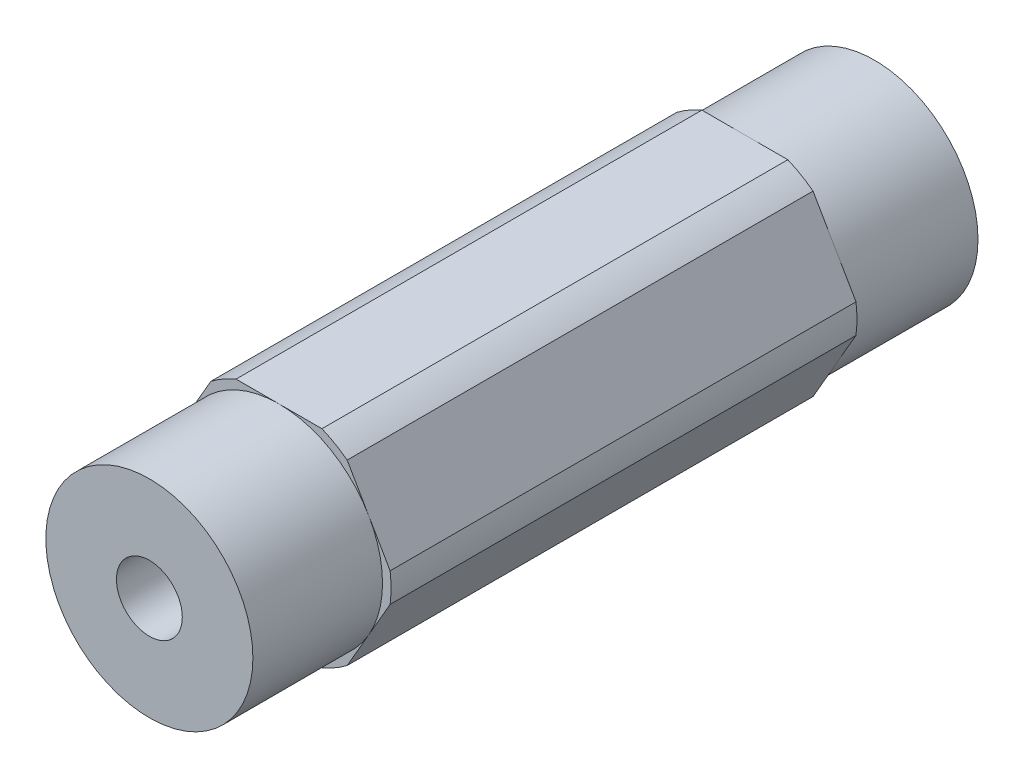
ISO-10303-21;
HEADER;
FILE_DESCRIPTION(('STEP AP214'),'2;1');
FILE_NAME('part.step','',(''),(''),'','','');
FILE_SCHEMA(('AUTOMOTIVE_DESIGN { 1 0 10303 214 1 1 1 1 }'));
ENDSEC;
DATA;
#1=APPLICATION_CONTEXT('core data for automotive mechanical design processes');
#2=APPLICATION_PROTOCOL_DEFINITION('international standard','automotive_design',2000,#1);
#3=PRODUCT_CONTEXT('',#1,'mechanical');
#4=PRODUCT('Part','Part','',(#3));
#5=PRODUCT_RELATED_PRODUCT_CATEGORY('part','',(#4));
#6=PRODUCT_DEFINITION_FORMATION('','',#4);
#7=PRODUCT_DEFINITION_CONTEXT('part definition',#1,'design');
#8=PRODUCT_DEFINITION('design','',#6,#7);
#9=PRODUCT_DEFINITION_SHAPE('','',#8);
#10=(LENGTH_UNIT() NAMED_UNIT(*) SI_UNIT(.MILLI.,.METRE.));
#11=(NAMED_UNIT(*) PLANE_ANGLE_UNIT() SI_UNIT($,.RADIAN.));
#12=(NAMED_UNIT(*) SI_UNIT($,.STERADIAN.) SOLID_ANGLE_UNIT());
#13=UNCERTAINTY_MEASURE_WITH_UNIT(LENGTH_MEASURE(1.E-05),#10,'distance_accuracy_value','');
#14=(GEOMETRIC_REPRESENTATION_CONTEXT(3) GLOBAL_UNCERTAINTY_ASSIGNED_CONTEXT((#13)) GLOBAL_UNIT_ASSIGNED_CONTEXT((#10,
#11,#12)) REPRESENTATION_CONTEXT('',''));
#15=CARTESIAN_POINT('',(0.,0.,0.));
#16=DIRECTION('',(0.,0.,1.));
#17=DIRECTION('',(1.,0.,0.));
#18=AXIS2_PLACEMENT_3D('',#15,#16,#17);
#19=CARTESIAN_POINT('',(3.66617420935409,6.34999999999998,22.2377));
#20=DIRECTION('',(0.,-1.,0.));
#21=DIRECTION('',(1.,0.,0.));
#22=AXIS2_PLACEMENT_3D('',#19,#20,#21);
#23=PLANE('',#22);
#24=DIRECTION('',(0.,0.,1.));
#25=VECTOR('',#24,1.);
#26=CARTESIAN_POINT('',(2.63498102459967,6.34999999999997,-22.2377));
#27=LINE('',#26,#25);
#28=CARTESIAN_POINT('',(2.63498102459967,6.34999999999997,-14.2875));
#29=VERTEX_POINT('',#28);
#30=CARTESIAN_POINT('',(2.63498102459967,6.34999999999997,14.2875));
#31=VERTEX_POINT('',#30);
#32=EDGE_CURVE('E325',#29,#31,#27,.T.);
#33=ORIENTED_EDGE('',*,*,#32,.F.);
#34=DIRECTION('',(1.,0.,0.));
#35=VECTOR('',#34,1.);
#36=CARTESIAN_POINT('',(3.66617420935409,6.34999999999998,-14.2875));
#37=LINE('',#36,#35);
#38=CARTESIAN_POINT('',(0.,6.34999999999997,-14.2875));
#39=VERTEX_POINT('',#38);
#40=EDGE_CURVE('E256',#39,#29,#37,.T.);
#41=ORIENTED_EDGE('',*,*,#40,.F.);
#42=CARTESIAN_POINT('',(-2.63498102459971,6.34999999999996,-14.2875));
#43=VERTEX_POINT('',#42);
#44=EDGE_CURVE('E260',#43,#39,#37,.T.);
#45=ORIENTED_EDGE('',*,*,#44,.F.);
#46=DIRECTION('',(0.,0.,1.));
#47=VECTOR('',#46,1.);
#48=CARTESIAN_POINT('',(-2.63498102459971,6.34999999999996,-22.2377));
#49=LINE('',#48,#47);
#50=CARTESIAN_POINT('',(-2.63498102459971,6.34999999999996,14.2875));
#51=VERTEX_POINT('',#50);
#52=EDGE_CURVE('E297',#51,#43,#49,.F.);
#53=ORIENTED_EDGE('',*,*,#52,.F.);
#54=DIRECTION('',(-1.,0.,0.));
#55=VECTOR('',#54,1.);
#56=CARTESIAN_POINT('',(3.66617420935409,6.34999999999998,14.2875));
#57=LINE('',#56,#55);
#58=CARTESIAN_POINT('',(0.,6.34999999999997,14.2875));
#59=VERTEX_POINT('',#58);
#60=EDGE_CURVE('E211',#59,#51,#57,.T.);
#61=ORIENTED_EDGE('',*,*,#60,.F.);
#62=EDGE_CURVE('E210',#31,#59,#57,.T.);
#63=ORIENTED_EDGE('',*,*,#62,.F.);
#64=EDGE_LOOP('',(#33,#41,#45,#53,#61,#63));
#65=FACE_BOUND('',#64,.T.);
#66=ADVANCED_FACE('F48',(#65),#23,.F.);
#67=CARTESIAN_POINT('',(-3.66617420935414,6.34999999999995,22.2377));
#68=DIRECTION('',(0.866025403784442,-0.499999999999995,0.));
#69=DIRECTION('',(0.499999999999995,0.866025403784442,0.));
#70=AXIS2_PLACEMENT_3D('',#67,#68,#69);
#71=PLANE('',#70);
#72=DIRECTION('',(0.,0.,1.));
#73=VECTOR('',#72,1.);
#74=CARTESIAN_POINT('',(-4.18177080173134,5.45696050579324,-22.2377));
#75=LINE('',#74,#73);
#76=CARTESIAN_POINT('',(-4.18177080173134,5.45696050579324,-14.2875));
#77=VERTEX_POINT('',#76);
#78=CARTESIAN_POINT('',(-4.18177080173134,5.45696050579324,14.2875));
#79=VERTEX_POINT('',#78);
#80=EDGE_CURVE('E300',#77,#79,#75,.T.);
#81=ORIENTED_EDGE('',*,*,#80,.F.);
#82=DIRECTION('',(0.499999999999995,0.866025403784442,0.));
#83=VECTOR('',#82,1.);
#84=CARTESIAN_POINT('',(-3.66617420935414,6.34999999999995,-14.2875));
#85=LINE('',#84,#83);
#86=CARTESIAN_POINT('',(-5.49926131403117,3.17499999999995,-14.2875));
#87=VERTEX_POINT('',#86);
#88=EDGE_CURVE('E247',#87,#77,#85,.T.);
#89=ORIENTED_EDGE('',*,*,#88,.F.);
#90=CARTESIAN_POINT('',(-6.81675182633101,0.893039494206661,-14.2875));
#91=VERTEX_POINT('',#90);
#92=EDGE_CURVE('E251',#91,#87,#85,.T.);
#93=ORIENTED_EDGE('',*,*,#92,.F.);
#94=DIRECTION('',(0.,0.,1.));
#95=VECTOR('',#94,1.);
#96=CARTESIAN_POINT('',(-6.81675182633101,0.893039494206661,-22.2377));
#97=LINE('',#96,#95);
#98=CARTESIAN_POINT('',(-6.81675182633101,0.893039494206661,14.2875));
#99=VERTEX_POINT('',#98);
#100=EDGE_CURVE('E71',#99,#91,#97,.F.);
#101=ORIENTED_EDGE('',*,*,#100,.F.);
#102=DIRECTION('',(-0.499999999999995,-0.866025403784442,0.));
#103=VECTOR('',#102,1.);
#104=CARTESIAN_POINT('',(-3.66617420935414,6.34999999999995,14.2875));
#105=LINE('',#104,#103);
#106=CARTESIAN_POINT('',(-5.49926131403117,3.17499999999995,14.2875));
#107=VERTEX_POINT('',#106);
#108=EDGE_CURVE('E216',#107,#99,#105,.T.);
#109=ORIENTED_EDGE('',*,*,#108,.F.);
#110=EDGE_CURVE('E215',#79,#107,#105,.T.);
#111=ORIENTED_EDGE('',*,*,#110,.F.);
#112=EDGE_LOOP('',(#81,#89,#93,#101,#109,#111));
#113=FACE_BOUND('',#112,.T.);
#114=ADVANCED_FACE('F436',(#113),#71,.F.);
#115=CARTESIAN_POINT('',(-7.33234841870821,0.,22.2377));
#116=DIRECTION('',(0.866025403784435,0.500000000000007,0.));
#117=DIRECTION('',(-0.500000000000007,0.866025403784435,0.));
#118=AXIS2_PLACEMENT_3D('',#115,#116,#117);
#119=PLANE('',#118);
#120=DIRECTION('',(0.,0.,1.));
#121=VECTOR('',#120,1.);
#122=CARTESIAN_POINT('',(-6.81675182633099,-0.893039494206758,-22.2377));
#123=LINE('',#122,#121);
#124=CARTESIAN_POINT('',(-6.81675182633099,-0.893039494206758,-14.2875));
#125=VERTEX_POINT('',#124);
#126=CARTESIAN_POINT('',(-6.81675182633099,-0.893039494206758,14.2875));
#127=VERTEX_POINT('',#126);
#128=EDGE_CURVE('E287',#125,#127,#123,.T.);
#129=ORIENTED_EDGE('',*,*,#128,.F.);
#130=DIRECTION('',(-0.500000000000007,0.866025403784435,0.));
#131=VECTOR('',#130,1.);
#132=CARTESIAN_POINT('',(-7.33234841870821,0.,-14.2875));
#133=LINE('',#132,#131);
#134=CARTESIAN_POINT('',(-5.49926131403113,-3.17500000000003,-14.2875));
#135=VERTEX_POINT('',#134);
#136=EDGE_CURVE('E241',#135,#125,#133,.T.);
#137=ORIENTED_EDGE('',*,*,#136,.F.);
#138=CARTESIAN_POINT('',(-4.18177080173127,-5.4569605057933,-14.2875));
#139=VERTEX_POINT('',#138);
#140=EDGE_CURVE('E245',#139,#135,#133,.T.);
#141=ORIENTED_EDGE('',*,*,#140,.F.);
#142=DIRECTION('',(0.,0.,1.));
#143=VECTOR('',#142,1.);
#144=CARTESIAN_POINT('',(-4.18177080173127,-5.4569605057933,-22.2377));
#145=LINE('',#144,#143);
#146=CARTESIAN_POINT('',(-4.18177080173127,-5.4569605057933,14.2875));
#147=VERTEX_POINT('',#146);
#148=EDGE_CURVE('E63',#147,#139,#145,.F.);
#149=ORIENTED_EDGE('',*,*,#148,.F.);
#150=DIRECTION('',(0.500000000000007,-0.866025403784435,0.));
#151=VECTOR('',#150,1.);
#152=CARTESIAN_POINT('',(-7.33234841870821,0.,14.2875));
#153=LINE('',#152,#151);
#154=CARTESIAN_POINT('',(-5.49926131403113,-3.17500000000003,14.2875));
#155=VERTEX_POINT('',#154);
#156=EDGE_CURVE('E221',#155,#147,#153,.T.);
#157=ORIENTED_EDGE('',*,*,#156,.F.);
#158=EDGE_CURVE('E220',#127,#155,#153,.T.);
#159=ORIENTED_EDGE('',*,*,#158,.F.);
#160=EDGE_LOOP('',(#129,#137,#141,#149,#157,#159));
#161=FACE_BOUND('',#160,.T.);
#162=ADVANCED_FACE('F429',(#161),#119,.F.);
#163=CARTESIAN_POINT('',(-3.66617420935405,-6.35,22.2377));
#164=DIRECTION('',(0.,1.,0.));
#165=DIRECTION('',(-1.,0.,0.));
#166=AXIS2_PLACEMENT_3D('',#163,#164,#165);
#167=PLANE('',#166);
#168=DIRECTION('',(0.,0.,1.));
#169=VECTOR('',#168,1.);
#170=CARTESIAN_POINT('',(-2.63498102459963,-6.34999999999999,-22.2377));
#171=LINE('',#170,#169);
#172=CARTESIAN_POINT('',(-2.63498102459963,-6.34999999999999,-14.2875));
#173=VERTEX_POINT('',#172);
#174=CARTESIAN_POINT('',(-2.63498102459963,-6.34999999999999,14.2875));
#175=VERTEX_POINT('',#174);
#176=EDGE_CURVE('E275',#173,#175,#171,.T.);
#177=ORIENTED_EDGE('',*,*,#176,.F.);
#178=DIRECTION('',(-1.,0.,0.));
#179=VECTOR('',#178,1.);
#180=CARTESIAN_POINT('',(-3.66617420935405,-6.35,-14.2875));
#181=LINE('',#180,#179);
#182=CARTESIAN_POINT('',(0.,-6.34999999999997,-14.2875));
#183=VERTEX_POINT('',#182);
#184=EDGE_CURVE('E246',#183,#173,#181,.T.);
#185=ORIENTED_EDGE('',*,*,#184,.F.);
#186=CARTESIAN_POINT('',(2.63498102459976,-6.34999999999994,-14.2875));
#187=VERTEX_POINT('',#186);
#188=EDGE_CURVE('E252',#187,#183,#181,.T.);
#189=ORIENTED_EDGE('',*,*,#188,.F.);
#190=DIRECTION('',(0.,0.,1.));
#191=VECTOR('',#190,1.);
#192=CARTESIAN_POINT('',(2.63498102459976,-6.34999999999994,-22.2377));
#193=LINE('',#192,#191);
#194=CARTESIAN_POINT('',(2.63498102459976,-6.34999999999994,14.2875));
#195=VERTEX_POINT('',#194);
#196=EDGE_CURVE('E311',#195,#187,#193,.F.);
#197=ORIENTED_EDGE('',*,*,#196,.F.);
#198=DIRECTION('',(1.,0.,0.));
#199=VECTOR('',#198,1.);
#200=CARTESIAN_POINT('',(-3.66617420935405,-6.35,14.2875));
#201=LINE('',#200,#199);
#202=CARTESIAN_POINT('',(0.,-6.34999999999997,14.2875));
#203=VERTEX_POINT('',#202);
#204=EDGE_CURVE('E226',#203,#195,#201,.T.);
#205=ORIENTED_EDGE('',*,*,#204,.F.);
#206=EDGE_CURVE('E225',#175,#203,#201,.T.);
#207=ORIENTED_EDGE('',*,*,#206,.F.);
#208=EDGE_LOOP('',(#177,#185,#189,#197,#205,#207));
#209=FACE_BOUND('',#208,.T.);
#210=ADVANCED_FACE('F443',(#209),#167,.F.);
#211=CARTESIAN_POINT('',(3.66617420935418,-6.34999999999993,22.2377));
#212=DIRECTION('',(-0.866025403784442,0.499999999999995,0.));
#213=DIRECTION('',(-0.499999999999995,-0.866025403784442,0.));
#214=AXIS2_PLACEMENT_3D('',#211,#212,#213);
#215=PLANE('',#214);
#216=DIRECTION('',(0.,0.,1.));
#217=VECTOR('',#216,1.);
#218=CARTESIAN_POINT('',(4.18177080173139,-5.4569605057932,-22.2377));
#219=LINE('',#218,#217);
#220=CARTESIAN_POINT('',(4.18177080173139,-5.4569605057932,-14.2875));
#221=VERTEX_POINT('',#220);
#222=CARTESIAN_POINT('',(4.18177080173139,-5.4569605057932,14.2875));
#223=VERTEX_POINT('',#222);
#224=EDGE_CURVE('E314',#221,#223,#219,.T.);
#225=ORIENTED_EDGE('',*,*,#224,.F.);
#226=DIRECTION('',(-0.499999999999995,-0.866025403784442,0.));
#227=VECTOR('',#226,1.);
#228=CARTESIAN_POINT('',(3.66617420935418,-6.34999999999993,-14.2875));
#229=LINE('',#228,#227);
#230=CARTESIAN_POINT('',(5.49926131403117,-3.17499999999995,-14.2875));
#231=VERTEX_POINT('',#230);
#232=EDGE_CURVE('E255',#231,#221,#229,.T.);
#233=ORIENTED_EDGE('',*,*,#232,.F.);
#234=CARTESIAN_POINT('',(6.816751826331,-0.893039494206728,-14.2875));
#235=VERTEX_POINT('',#234);
#236=EDGE_CURVE('E261',#235,#231,#229,.T.);
#237=ORIENTED_EDGE('',*,*,#236,.F.);
#238=DIRECTION('',(0.,0.,1.));
#239=VECTOR('',#238,1.);
#240=CARTESIAN_POINT('',(6.816751826331,-0.893039494206728,-22.2377));
#241=LINE('',#240,#239);
#242=CARTESIAN_POINT('',(6.816751826331,-0.893039494206728,14.2875));
#243=VERTEX_POINT('',#242);
#244=EDGE_CURVE('E176',#243,#235,#241,.F.);
#245=ORIENTED_EDGE('',*,*,#244,.F.);
#246=DIRECTION('',(0.499999999999995,0.866025403784442,0.));
#247=VECTOR('',#246,1.);
#248=CARTESIAN_POINT('',(3.66617420935418,-6.34999999999993,14.2875));
#249=LINE('',#248,#247);
#250=CARTESIAN_POINT('',(5.49926131403117,-3.17499999999995,14.2875));
#251=VERTEX_POINT('',#250);
#252=EDGE_CURVE('E231',#251,#243,#249,.T.);
#253=ORIENTED_EDGE('',*,*,#252,.F.);
#254=EDGE_CURVE('E230',#223,#251,#249,.T.);
#255=ORIENTED_EDGE('',*,*,#254,.F.);
#256=EDGE_LOOP('',(#225,#233,#237,#245,#253,#255));
#257=FACE_BOUND('',#256,.T.);
#258=ADVANCED_FACE('F477',(#257),#215,.F.);
#259=CARTESIAN_POINT('',(7.33234841870821,0.,22.2377));
#260=DIRECTION('',(-0.866025403784438,-0.500000000000001,0.));
#261=DIRECTION('',(0.500000000000001,-0.866025403784438,0.));
#262=AXIS2_PLACEMENT_3D('',#259,#260,#261);
#263=PLANE('',#262);
#264=DIRECTION('',(0.,0.,1.));
#265=VECTOR('',#264,1.);
#266=CARTESIAN_POINT('',(6.816751826331,0.89303949420671,-22.2377));
#267=LINE('',#266,#265);
#268=CARTESIAN_POINT('',(6.816751826331,0.893039494206714,-14.2875));
#269=VERTEX_POINT('',#268);
#270=CARTESIAN_POINT('',(6.816751826331,0.89303949420671,14.2875));
#271=VERTEX_POINT('',#270);
#272=EDGE_CURVE('E173',#269,#271,#267,.T.);
#273=ORIENTED_EDGE('',*,*,#272,.F.);
#274=DIRECTION('',(0.500000000000001,-0.866025403784438,0.));
#275=VECTOR('',#274,1.);
#276=CARTESIAN_POINT('',(7.33234841870821,0.,-14.2875));
#277=LINE('',#276,#275);
#278=CARTESIAN_POINT('',(5.49926131403115,3.17499999999999,-14.2875));
#279=VERTEX_POINT('',#278);
#280=EDGE_CURVE('E185',#279,#269,#277,.T.);
#281=ORIENTED_EDGE('',*,*,#280,.F.);
#282=CARTESIAN_POINT('',(4.18177080173131,5.45696050579327,-14.2875));
#283=VERTEX_POINT('',#282);
#284=EDGE_CURVE('E56',#283,#279,#277,.T.);
#285=ORIENTED_EDGE('',*,*,#284,.F.);
#286=DIRECTION('',(0.,0.,1.));
#287=VECTOR('',#286,1.);
#288=CARTESIAN_POINT('',(4.1817708017313,5.45696050579327,-22.2377));
#289=LINE('',#288,#287);
#290=CARTESIAN_POINT('',(4.1817708017313,5.45696050579327,14.2875));
#291=VERTEX_POINT('',#290);
#292=EDGE_CURVE('E328',#291,#283,#289,.F.);
#293=ORIENTED_EDGE('',*,*,#292,.F.);
#294=DIRECTION('',(-0.500000000000001,0.866025403784438,0.));
#295=VECTOR('',#294,1.);
#296=CARTESIAN_POINT('',(7.33234841870821,0.,14.2875));
#297=LINE('',#296,#295);
#298=CARTESIAN_POINT('',(5.49926131403115,3.17499999999999,14.2875));
#299=VERTEX_POINT('',#298);
#300=EDGE_CURVE('E202',#299,#291,#297,.T.);
#301=ORIENTED_EDGE('',*,*,#300,.F.);
#302=EDGE_CURVE('E187',#271,#299,#297,.T.);
#303=ORIENTED_EDGE('',*,*,#302,.F.);
#304=EDGE_LOOP('',(#273,#281,#285,#293,#301,#303));
#305=FACE_BOUND('',#304,.T.);
#306=ADVANCED_FACE('F183',(#305),#263,.F.);
#307=CARTESIAN_POINT('',(0.,0.,14.2875));
#308=DIRECTION('',(0.,0.,1.));
#309=DIRECTION('',(1.,0.,0.));
#310=AXIS2_PLACEMENT_3D('',#307,#308,#309);
#311=PLANE('',#310);
#312=ORIENTED_EDGE('',*,*,#300,.T.);
#313=CARTESIAN_POINT('',(0.,0.,14.2875));
#314=DIRECTION('',(0.,0.,1.));
#315=DIRECTION('',(1.,0.,0.));
#316=AXIS2_PLACEMENT_3D('',#313,#314,#315);
#317=CIRCLE('',#316,6.875);
#318=EDGE_CURVE('E321',#291,#31,#317,.T.);
#319=ORIENTED_EDGE('',*,*,#318,.T.);
#320=ORIENTED_EDGE('',*,*,#62,.T.);
#321=CARTESIAN_POINT('',(0.,0.,14.2875));
#322=DIRECTION('',(0.,0.,1.));
#323=DIRECTION('',(1.,0.,0.));
#324=AXIS2_PLACEMENT_3D('',#321,#322,#323);
#325=CIRCLE('',#324,6.34999999999997);
#326=EDGE_CURVE('E235',#299,#59,#325,.T.);
#327=ORIENTED_EDGE('',*,*,#326,.F.);
#328=EDGE_LOOP('',(#312,#319,#320,#327));
#329=FACE_BOUND('',#328,.T.);
#330=ADVANCED_FACE('F461',(#329),#311,.T.);
#331=ORIENTED_EDGE('',*,*,#60,.T.);
#332=CARTESIAN_POINT('',(0.,0.,14.2875));
#333=DIRECTION('',(0.,0.,1.));
#334=DIRECTION('',(1.,0.,0.));
#335=AXIS2_PLACEMENT_3D('',#332,#333,#334);
#336=CIRCLE('',#335,6.875);
#337=EDGE_CURVE('E293',#51,#79,#336,.T.);
#338=ORIENTED_EDGE('',*,*,#337,.T.);
#339=ORIENTED_EDGE('',*,*,#110,.T.);
#340=EDGE_CURVE('E239',#59,#107,#325,.T.);
#341=ORIENTED_EDGE('',*,*,#340,.F.);
#342=EDGE_LOOP('',(#331,#338,#339,#341));
#343=FACE_BOUND('',#342,.T.);
#344=ADVANCED_FACE('F385',(#343),#311,.T.);
#345=ORIENTED_EDGE('',*,*,#108,.T.);
#346=CARTESIAN_POINT('',(0.,0.,14.2875));
#347=DIRECTION('',(0.,0.,1.));
#348=DIRECTION('',(1.,0.,0.));
#349=AXIS2_PLACEMENT_3D('',#346,#347,#348);
#350=CIRCLE('',#349,6.875);
#351=EDGE_CURVE('E281',#99,#127,#350,.T.);
#352=ORIENTED_EDGE('',*,*,#351,.T.);
#353=ORIENTED_EDGE('',*,*,#158,.T.);
#354=EDGE_CURVE('E389',#107,#155,#325,.T.);
#355=ORIENTED_EDGE('',*,*,#354,.F.);
#356=EDGE_LOOP('',(#345,#352,#353,#355));
#357=FACE_BOUND('',#356,.T.);
#358=ADVANCED_FACE('F433',(#357),#311,.T.);
#359=ORIENTED_EDGE('',*,*,#156,.T.);
#360=CARTESIAN_POINT('',(0.,0.,14.2875));
#361=DIRECTION('',(0.,0.,1.));
#362=DIRECTION('',(1.,0.,0.));
#363=AXIS2_PLACEMENT_3D('',#360,#361,#362);
#364=CIRCLE('',#363,6.875);
#365=EDGE_CURVE('E269',#147,#175,#364,.T.);
#366=ORIENTED_EDGE('',*,*,#365,.T.);
#367=ORIENTED_EDGE('',*,*,#206,.T.);
#368=EDGE_CURVE('E391',#155,#203,#325,.T.);
#369=ORIENTED_EDGE('',*,*,#368,.F.);
#370=EDGE_LOOP('',(#359,#366,#367,#369));
#371=FACE_BOUND('',#370,.T.);
#372=ADVANCED_FACE('F447',(#371),#311,.T.);
#373=ORIENTED_EDGE('',*,*,#204,.T.);
#374=CARTESIAN_POINT('',(0.,0.,14.2875));
#375=DIRECTION('',(0.,0.,1.));
#376=DIRECTION('',(1.,0.,0.));
#377=AXIS2_PLACEMENT_3D('',#374,#375,#376);
#378=CIRCLE('',#377,6.875);
#379=EDGE_CURVE('E307',#195,#223,#378,.T.);
#380=ORIENTED_EDGE('',*,*,#379,.T.);
#381=ORIENTED_EDGE('',*,*,#254,.T.);
#382=EDGE_CURVE('E395',#203,#251,#325,.T.);
#383=ORIENTED_EDGE('',*,*,#382,.F.);
#384=EDGE_LOOP('',(#373,#380,#381,#383));
#385=FACE_BOUND('',#384,.T.);
#386=ADVANCED_FACE('F450',(#385),#311,.T.);
#387=ORIENTED_EDGE('',*,*,#252,.T.);
#388=CARTESIAN_POINT('',(0.,0.,14.2875));
#389=DIRECTION('',(0.,0.,1.));
#390=DIRECTION('',(1.,0.,0.));
#391=AXIS2_PLACEMENT_3D('',#388,#389,#390);
#392=CIRCLE('',#391,6.875);
#393=EDGE_CURVE('E335',#243,#271,#392,.T.);
#394=ORIENTED_EDGE('',*,*,#393,.T.);
#395=ORIENTED_EDGE('',*,*,#302,.T.);
#396=EDGE_CURVE('E240',#251,#299,#325,.T.);
#397=ORIENTED_EDGE('',*,*,#396,.F.);
#398=EDGE_LOOP('',(#387,#394,#395,#397));
#399=FACE_BOUND('',#398,.T.);
#400=ADVANCED_FACE('F456',(#399),#311,.T.);
#401=CARTESIAN_POINT('',(0.,0.,-14.2875));
#402=DIRECTION('',(0.,0.,-1.));
#403=DIRECTION('',(-1.,0.,0.));
#404=AXIS2_PLACEMENT_3D('',#401,#402,#403);
#405=PLANE('',#404);
#406=ORIENTED_EDGE('',*,*,#184,.T.);
#407=CARTESIAN_POINT('',(0.,0.,-14.2875));
#408=DIRECTION('',(0.,0.,-1.));
#409=DIRECTION('',(-1.,0.,0.));
#410=AXIS2_PLACEMENT_3D('',#407,#408,#409);
#411=CIRCLE('',#410,6.875);
#412=EDGE_CURVE('E278',#173,#139,#411,.T.);
#413=ORIENTED_EDGE('',*,*,#412,.T.);
#414=ORIENTED_EDGE('',*,*,#140,.T.);
#415=CARTESIAN_POINT('',(0.,0.,-14.2875));
#416=DIRECTION('',(0.,0.,1.));
#417=DIRECTION('',(1.,0.,0.));
#418=AXIS2_PLACEMENT_3D('',#415,#416,#417);
#419=CIRCLE('',#418,6.34999999999997);
#420=EDGE_CURVE('E409',#135,#183,#419,.T.);
#421=ORIENTED_EDGE('',*,*,#420,.T.);
#422=EDGE_LOOP('',(#406,#413,#414,#421));
#423=FACE_BOUND('',#422,.T.);
#424=ADVANCED_FACE('F408',(#423),#405,.T.);
#425=ORIENTED_EDGE('',*,*,#136,.T.);
#426=CARTESIAN_POINT('',(0.,0.,-14.2875));
#427=DIRECTION('',(0.,0.,-1.));
#428=DIRECTION('',(-1.,0.,0.));
#429=AXIS2_PLACEMENT_3D('',#426,#427,#428);
#430=CIRCLE('',#429,6.875);
#431=EDGE_CURVE('E290',#125,#91,#430,.T.);
#432=ORIENTED_EDGE('',*,*,#431,.T.);
#433=ORIENTED_EDGE('',*,*,#92,.T.);
#434=EDGE_CURVE('E419',#87,#135,#419,.T.);
#435=ORIENTED_EDGE('',*,*,#434,.T.);
#436=EDGE_LOOP('',(#425,#432,#433,#435));
#437=FACE_BOUND('',#436,.T.);
#438=ADVANCED_FACE('F425',(#437),#405,.T.);
#439=ORIENTED_EDGE('',*,*,#88,.T.);
#440=CARTESIAN_POINT('',(0.,0.,-14.2875));
#441=DIRECTION('',(0.,0.,-1.));
#442=DIRECTION('',(-1.,0.,0.));
#443=AXIS2_PLACEMENT_3D('',#440,#441,#442);
#444=CIRCLE('',#443,6.875);
#445=EDGE_CURVE('E303',#77,#43,#444,.T.);
#446=ORIENTED_EDGE('',*,*,#445,.T.);
#447=ORIENTED_EDGE('',*,*,#44,.T.);
#448=EDGE_CURVE('E268',#39,#87,#419,.T.);
#449=ORIENTED_EDGE('',*,*,#448,.T.);
#450=EDGE_LOOP('',(#439,#446,#447,#449));
#451=FACE_BOUND('',#450,.T.);
#452=ADVANCED_FACE('F480',(#451),#405,.T.);
#453=ORIENTED_EDGE('',*,*,#232,.T.);
#454=CARTESIAN_POINT('',(0.,0.,-14.2875));
#455=DIRECTION('',(0.,0.,-1.));
#456=DIRECTION('',(-1.,0.,0.));
#457=AXIS2_PLACEMENT_3D('',#454,#455,#456);
#458=CIRCLE('',#457,6.875);
#459=EDGE_CURVE('E317',#221,#187,#458,.T.);
#460=ORIENTED_EDGE('',*,*,#459,.T.);
#461=ORIENTED_EDGE('',*,*,#188,.T.);
#462=EDGE_CURVE('E422',#183,#231,#419,.T.);
#463=ORIENTED_EDGE('',*,*,#462,.T.);
#464=EDGE_LOOP('',(#453,#460,#461,#463));
#465=FACE_BOUND('',#464,.T.);
#466=ADVANCED_FACE('F476',(#465),#405,.T.);
#467=ORIENTED_EDGE('',*,*,#40,.T.);
#468=CARTESIAN_POINT('',(0.,0.,-14.2875));
#469=DIRECTION('',(0.,0.,-1.));
#470=DIRECTION('',(-1.,0.,0.));
#471=AXIS2_PLACEMENT_3D('',#468,#469,#470);
#472=CIRCLE('',#471,6.875);
#473=EDGE_CURVE('E331',#29,#283,#472,.T.);
#474=ORIENTED_EDGE('',*,*,#473,.T.);
#475=ORIENTED_EDGE('',*,*,#284,.T.);
#476=EDGE_CURVE('E264',#279,#39,#419,.T.);
#477=ORIENTED_EDGE('',*,*,#476,.T.);
#478=EDGE_LOOP('',(#467,#474,#475,#477));
#479=FACE_BOUND('',#478,.T.);
#480=ADVANCED_FACE('F467',(#479),#405,.T.);
#481=ORIENTED_EDGE('',*,*,#280,.T.);
#482=CARTESIAN_POINT('',(0.,0.,-14.2875));
#483=DIRECTION('',(0.,0.,-1.));
#484=DIRECTION('',(-1.,0.,0.));
#485=AXIS2_PLACEMENT_3D('',#482,#483,#484);
#486=CIRCLE('',#485,6.875);
#487=EDGE_CURVE('E12',#269,#235,#486,.T.);
#488=ORIENTED_EDGE('',*,*,#487,.T.);
#489=ORIENTED_EDGE('',*,*,#236,.T.);
#490=EDGE_CURVE('E194',#231,#279,#419,.T.);
#491=ORIENTED_EDGE('',*,*,#490,.T.);
#492=EDGE_LOOP('',(#481,#488,#489,#491));
#493=FACE_BOUND('',#492,.T.);
#494=ADVANCED_FACE('F192',(#493),#405,.T.);
#495=CARTESIAN_POINT('',(0.,0.,14.2875));
#496=DIRECTION('',(0.,0.,1.));
#497=DIRECTION('',(1.,0.,0.));
#498=AXIS2_PLACEMENT_3D('',#495,#496,#497);
#499=CYLINDRICAL_SURFACE('',#498,6.34999999999997);
#500=CARTESIAN_POINT('',(0.,0.,22.2377));
#501=DIRECTION('',(0.,0.,1.));
#502=DIRECTION('',(1.,0.,0.));
#503=AXIS2_PLACEMENT_3D('',#500,#501,#502);
#504=CIRCLE('',#503,6.34999999999997);
#505=CARTESIAN_POINT('',(6.34999999999997,0.,22.2377));
#506=VERTEX_POINT('',#505);
#507=EDGE_CURVE('E206',#506,#506,#504,.T.);
#508=ORIENTED_EDGE('',*,*,#507,.F.);
#509=EDGE_LOOP('',(#508));
#510=FACE_BOUND('',#509,.T.);
#511=ORIENTED_EDGE('',*,*,#326,.T.);
#512=ORIENTED_EDGE('',*,*,#340,.T.);
#513=ORIENTED_EDGE('',*,*,#354,.T.);
#514=ORIENTED_EDGE('',*,*,#368,.T.);
#515=ORIENTED_EDGE('',*,*,#382,.T.);
#516=ORIENTED_EDGE('',*,*,#396,.T.);
#517=EDGE_LOOP('',(#511,#512,#513,#514,#515,#516));
#518=FACE_BOUND('',#517,.T.);
#519=ADVANCED_FACE('F362',(#510,#518),#499,.T.);
#520=CARTESIAN_POINT('',(0.,0.,22.2377));
#521=DIRECTION('',(0.,0.,1.));
#522=DIRECTION('',(1.,0.,0.));
#523=AXIS2_PLACEMENT_3D('',#520,#521,#522);
#524=PLANE('',#523);
#525=CARTESIAN_POINT('',(0.,0.,22.2377));
#526=DIRECTION('',(0.,0.,1.));
#527=DIRECTION('',(1.,0.,0.));
#528=AXIS2_PLACEMENT_3D('',#525,#526,#527);
#529=CIRCLE('',#528,2.0193);
#530=CARTESIAN_POINT('',(2.0193,0.,22.2377));
#531=VERTEX_POINT('',#530);
#532=EDGE_CURVE('E340',#531,#531,#529,.T.);
#533=ORIENTED_EDGE('',*,*,#532,.F.);
#534=EDGE_LOOP('',(#533));
#535=FACE_BOUND('',#534,.T.);
#536=ORIENTED_EDGE('',*,*,#507,.T.);
#537=EDGE_LOOP('',(#536));
#538=FACE_BOUND('',#537,.T.);
#539=ADVANCED_FACE('F358',(#535,#538),#524,.T.);
#540=CARTESIAN_POINT('',(0.,0.,-14.2875));
#541=DIRECTION('',(0.,0.,-1.));
#542=DIRECTION('',(-1.,0.,0.));
#543=AXIS2_PLACEMENT_3D('',#540,#541,#542);
#544=CYLINDRICAL_SURFACE('',#543,6.34999999999997);
#545=ORIENTED_EDGE('',*,*,#448,.F.);
#546=ORIENTED_EDGE('',*,*,#476,.F.);
#547=ORIENTED_EDGE('',*,*,#490,.F.);
#548=ORIENTED_EDGE('',*,*,#462,.F.);
#549=ORIENTED_EDGE('',*,*,#420,.F.);
#550=ORIENTED_EDGE('',*,*,#434,.F.);
#551=EDGE_LOOP('',(#545,#546,#547,#548,#549,#550));
#552=FACE_BOUND('',#551,.T.);
#553=CARTESIAN_POINT('',(0.,0.,-22.2377));
#554=DIRECTION('',(0.,0.,1.));
#555=DIRECTION('',(1.,0.,0.));
#556=AXIS2_PLACEMENT_3D('',#553,#554,#555);
#557=CIRCLE('',#556,6.34999999999997);
#558=CARTESIAN_POINT('',(6.34999999999997,0.,-22.2377));
#559=VERTEX_POINT('',#558);
#560=EDGE_CURVE('E196',#559,#559,#557,.F.);
#561=ORIENTED_EDGE('',*,*,#560,.F.);
#562=EDGE_LOOP('',(#561));
#563=FACE_BOUND('',#562,.T.);
#564=ADVANCED_FACE('F361',(#552,#563),#544,.T.);
#565=CARTESIAN_POINT('',(0.,0.,-22.2377));
#566=DIRECTION('',(0.,0.,1.));
#567=DIRECTION('',(1.,0.,0.));
#568=AXIS2_PLACEMENT_3D('',#565,#566,#567);
#569=PLANE('',#568);
#570=CARTESIAN_POINT('',(0.,0.,-22.2377));
#571=DIRECTION('',(0.,0.,1.));
#572=DIRECTION('',(1.,0.,0.));
#573=AXIS2_PLACEMENT_3D('',#570,#571,#572);
#574=CIRCLE('',#573,2.0193);
#575=CARTESIAN_POINT('',(2.0193,0.,-22.2377));
#576=VERTEX_POINT('',#575);
#577=EDGE_CURVE('E189',#576,#576,#574,.T.);
#578=ORIENTED_EDGE('',*,*,#577,.T.);
#579=EDGE_LOOP('',(#578));
#580=FACE_BOUND('',#579,.T.);
#581=ORIENTED_EDGE('',*,*,#560,.T.);
#582=EDGE_LOOP('',(#581));
#583=FACE_BOUND('',#582,.T.);
#584=ADVANCED_FACE('F348',(#580,#583),#569,.F.);
#585=CARTESIAN_POINT('',(0.,0.,-22.2377));
#586=DIRECTION('',(0.,0.,1.));
#587=DIRECTION('',(1.,0.,0.));
#588=AXIS2_PLACEMENT_3D('',#585,#586,#587);
#589=CYLINDRICAL_SURFACE('',#588,6.875);
#590=ORIENTED_EDGE('',*,*,#244,.T.);
#591=ORIENTED_EDGE('',*,*,#487,.F.);
#592=ORIENTED_EDGE('',*,*,#272,.T.);
#593=ORIENTED_EDGE('',*,*,#393,.F.);
#594=EDGE_LOOP('',(#590,#591,#592,#593));
#595=FACE_BOUND('',#594,.T.);
#596=ADVANCED_FACE('F172',(#595),#589,.T.);
#597=ORIENTED_EDGE('',*,*,#292,.T.);
#598=ORIENTED_EDGE('',*,*,#473,.F.);
#599=ORIENTED_EDGE('',*,*,#32,.T.);
#600=ORIENTED_EDGE('',*,*,#318,.F.);
#601=EDGE_LOOP('',(#597,#598,#599,#600));
#602=FACE_BOUND('',#601,.T.);
#603=ADVANCED_FACE('F464',(#602),#589,.T.);
#604=ORIENTED_EDGE('',*,*,#196,.T.);
#605=ORIENTED_EDGE('',*,*,#459,.F.);
#606=ORIENTED_EDGE('',*,*,#224,.T.);
#607=ORIENTED_EDGE('',*,*,#379,.F.);
#608=EDGE_LOOP('',(#604,#605,#606,#607));
#609=FACE_BOUND('',#608,.T.);
#610=ADVANCED_FACE('F484',(#609),#589,.T.);
#611=ORIENTED_EDGE('',*,*,#52,.T.);
#612=ORIENTED_EDGE('',*,*,#445,.F.);
#613=ORIENTED_EDGE('',*,*,#80,.T.);
#614=ORIENTED_EDGE('',*,*,#337,.F.);
#615=EDGE_LOOP('',(#611,#612,#613,#614));
#616=FACE_BOUND('',#615,.T.);
#617=ADVANCED_FACE('F482',(#616),#589,.T.);
#618=ORIENTED_EDGE('',*,*,#100,.T.);
#619=ORIENTED_EDGE('',*,*,#431,.F.);
#620=ORIENTED_EDGE('',*,*,#128,.T.);
#621=ORIENTED_EDGE('',*,*,#351,.F.);
#622=EDGE_LOOP('',(#618,#619,#620,#621));
#623=FACE_BOUND('',#622,.T.);
#624=ADVANCED_FACE('F431',(#623),#589,.T.);
#625=ORIENTED_EDGE('',*,*,#148,.T.);
#626=ORIENTED_EDGE('',*,*,#412,.F.);
#627=ORIENTED_EDGE('',*,*,#176,.T.);
#628=ORIENTED_EDGE('',*,*,#365,.F.);
#629=EDGE_LOOP('',(#625,#626,#627,#628));
#630=FACE_BOUND('',#629,.T.);
#631=ADVANCED_FACE('F354',(#630),#589,.T.);
#632=CARTESIAN_POINT('',(0.,0.,-22.2377));
#633=DIRECTION('',(0.,0.,1.));
#634=DIRECTION('',(1.,0.,0.));
#635=AXIS2_PLACEMENT_3D('',#632,#633,#634);
#636=CYLINDRICAL_SURFACE('',#635,2.0193);
#637=ORIENTED_EDGE('',*,*,#577,.F.);
#638=EDGE_LOOP('',(#637));
#639=FACE_BOUND('',#638,.T.);
#640=ORIENTED_EDGE('',*,*,#532,.T.);
#641=EDGE_LOOP('',(#640));
#642=FACE_BOUND('',#641,.T.);
#643=ADVANCED_FACE('F351',(#639,#642),#636,.F.);
#644=CLOSED_SHELL('',(#66,#114,#162,#210,#258,#306,#330,#344,#358,#372,#386,#400,#424,#438,#452,
#466,#480,#494,#519,#539,#564,#584,#596,#603,#610,#617,#624,#631,#643));
#645=MANIFOLD_SOLID_BREP('B2',#644);
#646=ADVANCED_BREP_SHAPE_REPRESENTATION('',(#18,#645),#14);
#647=SHAPE_DEFINITION_REPRESENTATION(#9,#646);
ENDSEC;
END-ISO-10303-21;
